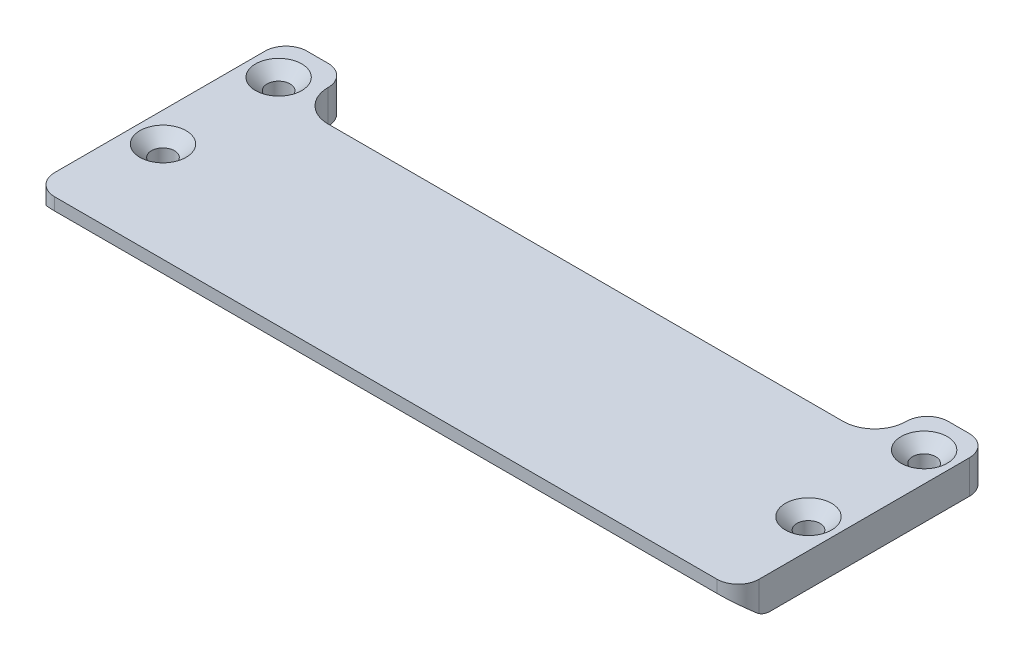
ISO-10303-21;
HEADER;
FILE_DESCRIPTION(('STEP AP214'),'2;1');
FILE_NAME('part.step','',(''),(''),'','','');
FILE_SCHEMA(('AUTOMOTIVE_DESIGN { 1 0 10303 214 1 1 1 1 }'));
ENDSEC;
DATA;
#1=APPLICATION_CONTEXT('core data for automotive mechanical design processes');
#2=APPLICATION_PROTOCOL_DEFINITION('international standard','automotive_design',2000,#1);
#3=PRODUCT_CONTEXT('',#1,'mechanical');
#4=PRODUCT('Part','Part','',(#3));
#5=PRODUCT_RELATED_PRODUCT_CATEGORY('part','',(#4));
#6=PRODUCT_DEFINITION_FORMATION('','',#4);
#7=PRODUCT_DEFINITION_CONTEXT('part definition',#1,'design');
#8=PRODUCT_DEFINITION('design','',#6,#7);
#9=PRODUCT_DEFINITION_SHAPE('','',#8);
#10=(LENGTH_UNIT() NAMED_UNIT(*) SI_UNIT(.MILLI.,.METRE.));
#11=(NAMED_UNIT(*) PLANE_ANGLE_UNIT() SI_UNIT($,.RADIAN.));
#12=(NAMED_UNIT(*) SI_UNIT($,.STERADIAN.) SOLID_ANGLE_UNIT());
#13=UNCERTAINTY_MEASURE_WITH_UNIT(LENGTH_MEASURE(1.E-05),#10,'distance_accuracy_value','');
#14=(GEOMETRIC_REPRESENTATION_CONTEXT(3) GLOBAL_UNCERTAINTY_ASSIGNED_CONTEXT((#13)) GLOBAL_UNIT_ASSIGNED_CONTEXT((#10,
#11,#12)) REPRESENTATION_CONTEXT('',''));
#15=CARTESIAN_POINT('',(0.,0.,0.));
#16=DIRECTION('',(0.,0.,1.));
#17=DIRECTION('',(1.,0.,0.));
#18=AXIS2_PLACEMENT_3D('',#15,#16,#17);
#19=CARTESIAN_POINT('',(-33.5,3.175,-12.));
#20=DIRECTION('',(0.,0.,1.));
#21=DIRECTION('',(1.,0.,0.));
#22=AXIS2_PLACEMENT_3D('',#19,#20,#21);
#23=PLANE('',#22);
#24=DIRECTION('',(-1.,0.,0.));
#25=VECTOR('',#24,1.);
#26=CARTESIAN_POINT('',(-33.5,3.175,-12.));
#27=LINE('',#26,#25);
#28=CARTESIAN_POINT('',(31.5,3.175,-12.));
#29=VERTEX_POINT('',#28);
#30=CARTESIAN_POINT('',(29.5,3.175,-12.));
#31=VERTEX_POINT('',#30);
#32=EDGE_CURVE('E297',#29,#31,#27,.T.);
#33=ORIENTED_EDGE('',*,*,#32,.F.);
#34=DIRECTION('',(0.,-1.,0.));
#35=VECTOR('',#34,1.);
#36=CARTESIAN_POINT('',(31.5,3.175,-12.));
#37=LINE('',#36,#35);
#38=CARTESIAN_POINT('',(31.5,0.,-12.));
#39=VERTEX_POINT('',#38);
#40=EDGE_CURVE('E209',#29,#39,#37,.T.);
#41=ORIENTED_EDGE('',*,*,#40,.T.);
#42=DIRECTION('',(-1.,0.,0.));
#43=VECTOR('',#42,1.);
#44=CARTESIAN_POINT('',(-33.5,0.,-12.));
#45=LINE('',#44,#43);
#46=CARTESIAN_POINT('',(29.5,0.,-12.));
#47=VERTEX_POINT('',#46);
#48=EDGE_CURVE('E363',#39,#47,#45,.T.);
#49=ORIENTED_EDGE('',*,*,#48,.T.);
#50=DIRECTION('',(0.,1.,0.));
#51=VECTOR('',#50,1.);
#52=CARTESIAN_POINT('',(29.5,3.175,-12.));
#53=LINE('',#52,#51);
#54=EDGE_CURVE('E206',#47,#31,#53,.T.);
#55=ORIENTED_EDGE('',*,*,#54,.T.);
#56=EDGE_LOOP('',(#33,#41,#49,#55));
#57=FACE_BOUND('',#56,.T.);
#58=ADVANCED_FACE('F35',(#57),#23,.F.);
#59=CARTESIAN_POINT('',(33.5,3.175,12.));
#60=DIRECTION('',(-1.,0.,0.));
#61=DIRECTION('',(0.,0.,1.));
#62=AXIS2_PLACEMENT_3D('',#59,#60,#61);
#63=PLANE('',#62);
#64=DIRECTION('',(0.,0.,-1.));
#65=VECTOR('',#64,1.);
#66=CARTESIAN_POINT('',(33.5,0.,12.));
#67=LINE('',#66,#65);
#68=CARTESIAN_POINT('',(33.5,0.,8.88855234627917));
#69=VERTEX_POINT('',#68);
#70=CARTESIAN_POINT('',(33.5,0.,-10.));
#71=VERTEX_POINT('',#70);
#72=EDGE_CURVE('E155',#69,#71,#67,.T.);
#73=ORIENTED_EDGE('',*,*,#72,.T.);
#74=DIRECTION('',(0.,-1.,0.));
#75=VECTOR('',#74,1.);
#76=CARTESIAN_POINT('',(33.5,3.175,-10.));
#77=LINE('',#76,#75);
#78=CARTESIAN_POINT('',(33.5,3.175,-10.));
#79=VERTEX_POINT('',#78);
#80=EDGE_CURVE('E220',#71,#79,#77,.F.);
#81=ORIENTED_EDGE('',*,*,#80,.T.);
#82=DIRECTION('',(0.,0.,-1.));
#83=VECTOR('',#82,1.);
#84=CARTESIAN_POINT('',(33.5,3.175,12.));
#85=LINE('',#84,#83);
#86=CARTESIAN_POINT('',(33.5,3.175,10.));
#87=VERTEX_POINT('',#86);
#88=EDGE_CURVE('E298',#87,#79,#85,.T.);
#89=ORIENTED_EDGE('',*,*,#88,.F.);
#90=DIRECTION('',(0.,-1.,0.));
#91=VECTOR('',#90,1.);
#92=CARTESIAN_POINT('',(33.5,3.175,10.));
#93=LINE('',#92,#91);
#94=CARTESIAN_POINT('',(33.5,0.337266072686776,10.));
#95=VERTEX_POINT('',#94);
#96=EDGE_CURVE('E159',#87,#95,#93,.T.);
#97=ORIENTED_EDGE('',*,*,#96,.T.);
#98=CARTESIAN_POINT('',(33.5,2.,8.88855234627917));
#99=DIRECTION('',(-1.,0.,0.));
#100=DIRECTION('',(0.,0.,1.));
#101=AXIS2_PLACEMENT_3D('',#98,#99,#100);
#102=CIRCLE('',#101,2.);
#103=EDGE_CURVE('E152',#95,#69,#102,.F.);
#104=ORIENTED_EDGE('',*,*,#103,.T.);
#105=EDGE_LOOP('',(#73,#81,#89,#97,#104));
#106=FACE_BOUND('',#105,.T.);
#107=ADVANCED_FACE('F154',(#106),#63,.F.);
#108=CARTESIAN_POINT('',(-29.5,3.175,-12.));
#109=VERTEX_POINT('',#108);
#110=CARTESIAN_POINT('',(-31.5,3.175,-12.));
#111=VERTEX_POINT('',#110);
#112=EDGE_CURVE('E290',#109,#111,#27,.T.);
#113=ORIENTED_EDGE('',*,*,#112,.F.);
#114=DIRECTION('',(0.,-1.,0.));
#115=VECTOR('',#114,1.);
#116=CARTESIAN_POINT('',(-29.5,3.175,-12.));
#117=LINE('',#116,#115);
#118=CARTESIAN_POINT('',(-29.5,0.,-12.));
#119=VERTEX_POINT('',#118);
#120=EDGE_CURVE('E11',#109,#119,#117,.T.);
#121=ORIENTED_EDGE('',*,*,#120,.T.);
#122=CARTESIAN_POINT('',(-31.5,0.,-12.));
#123=VERTEX_POINT('',#122);
#124=EDGE_CURVE('E173',#119,#123,#45,.T.);
#125=ORIENTED_EDGE('',*,*,#124,.T.);
#126=DIRECTION('',(0.,-1.,0.));
#127=VECTOR('',#126,1.);
#128=CARTESIAN_POINT('',(-31.5,3.175,-12.));
#129=LINE('',#128,#127);
#130=EDGE_CURVE('E43',#123,#111,#129,.F.);
#131=ORIENTED_EDGE('',*,*,#130,.T.);
#132=EDGE_LOOP('',(#113,#121,#125,#131));
#133=FACE_BOUND('',#132,.T.);
#134=ADVANCED_FACE('F273',(#133),#23,.F.);
#135=CARTESIAN_POINT('',(-33.5,3.175,12.));
#136=DIRECTION('',(1.,0.,0.));
#137=DIRECTION('',(0.,0.,-1.));
#138=AXIS2_PLACEMENT_3D('',#135,#136,#137);
#139=PLANE('',#138);
#140=CARTESIAN_POINT('',(-33.5,2.,8.88855234627917));
#141=DIRECTION('',(1.,0.,0.));
#142=DIRECTION('',(0.,0.,-1.));
#143=AXIS2_PLACEMENT_3D('',#140,#141,#142);
#144=CIRCLE('',#143,2.);
#145=CARTESIAN_POINT('',(-33.5,0.,8.88855234627917));
#146=VERTEX_POINT('',#145);
#147=CARTESIAN_POINT('',(-33.5,0.337266072686776,10.));
#148=VERTEX_POINT('',#147);
#149=EDGE_CURVE('E179',#146,#148,#144,.F.);
#150=ORIENTED_EDGE('',*,*,#149,.T.);
#151=DIRECTION('',(0.,-1.,0.));
#152=VECTOR('',#151,1.);
#153=CARTESIAN_POINT('',(-33.5,3.175,10.));
#154=LINE('',#153,#152);
#155=CARTESIAN_POINT('',(-33.5,3.175,10.));
#156=VERTEX_POINT('',#155);
#157=EDGE_CURVE('E398',#148,#156,#154,.F.);
#158=ORIENTED_EDGE('',*,*,#157,.T.);
#159=DIRECTION('',(0.,0.,1.));
#160=VECTOR('',#159,1.);
#161=CARTESIAN_POINT('',(-33.5,3.175,12.));
#162=LINE('',#161,#160);
#163=CARTESIAN_POINT('',(-33.5,3.175,-10.));
#164=VERTEX_POINT('',#163);
#165=EDGE_CURVE('E358',#164,#156,#162,.T.);
#166=ORIENTED_EDGE('',*,*,#165,.F.);
#167=DIRECTION('',(0.,-1.,0.));
#168=VECTOR('',#167,1.);
#169=CARTESIAN_POINT('',(-33.5,3.175,-10.));
#170=LINE('',#169,#168);
#171=CARTESIAN_POINT('',(-33.5,0.,-10.));
#172=VERTEX_POINT('',#171);
#173=EDGE_CURVE('E396',#164,#172,#170,.T.);
#174=ORIENTED_EDGE('',*,*,#173,.T.);
#175=DIRECTION('',(0.,0.,1.));
#176=VECTOR('',#175,1.);
#177=CARTESIAN_POINT('',(-33.5,0.,12.));
#178=LINE('',#177,#176);
#179=EDGE_CURVE('E356',#172,#146,#178,.T.);
#180=ORIENTED_EDGE('',*,*,#179,.T.);
#181=EDGE_LOOP('',(#150,#158,#166,#174,#180));
#182=FACE_BOUND('',#181,.T.);
#183=ADVANCED_FACE('F281',(#182),#139,.F.);
#184=CARTESIAN_POINT('',(-33.5,3.175,12.));
#185=DIRECTION('',(0.,0.,-1.));
#186=DIRECTION('',(-1.,0.,0.));
#187=AXIS2_PLACEMENT_3D('',#184,#185,#186);
#188=PLANE('',#187);
#189=DIRECTION('',(1.,0.,0.));
#190=VECTOR('',#189,1.);
#191=CARTESIAN_POINT('',(33.5,2.00000000000001,12.));
#192=LINE('',#191,#190);
#193=CARTESIAN_POINT('',(-31.5,2.00000000000001,12.));
#194=VERTEX_POINT('',#193);
#195=CARTESIAN_POINT('',(31.5,2.00000000000001,12.));
#196=VERTEX_POINT('',#195);
#197=EDGE_CURVE('E180',#194,#196,#192,.T.);
#198=ORIENTED_EDGE('',*,*,#197,.T.);
#199=DIRECTION('',(0.,-1.,0.));
#200=VECTOR('',#199,1.);
#201=CARTESIAN_POINT('',(31.5,3.175,12.));
#202=LINE('',#201,#200);
#203=CARTESIAN_POINT('',(31.5,3.175,12.));
#204=VERTEX_POINT('',#203);
#205=EDGE_CURVE('E394',#196,#204,#202,.F.);
#206=ORIENTED_EDGE('',*,*,#205,.T.);
#207=DIRECTION('',(1.,0.,0.));
#208=VECTOR('',#207,1.);
#209=CARTESIAN_POINT('',(-33.5,3.175,12.));
#210=LINE('',#209,#208);
#211=CARTESIAN_POINT('',(-31.5,3.175,12.));
#212=VERTEX_POINT('',#211);
#213=EDGE_CURVE('E183',#212,#204,#210,.T.);
#214=ORIENTED_EDGE('',*,*,#213,.F.);
#215=DIRECTION('',(0.,-1.,0.));
#216=VECTOR('',#215,1.);
#217=CARTESIAN_POINT('',(-31.5,3.175,12.));
#218=LINE('',#217,#216);
#219=EDGE_CURVE('E390',#212,#194,#218,.T.);
#220=ORIENTED_EDGE('',*,*,#219,.T.);
#221=EDGE_LOOP('',(#198,#206,#214,#220));
#222=FACE_BOUND('',#221,.T.);
#223=ADVANCED_FACE('F286',(#222),#188,.F.);
#224=CARTESIAN_POINT('',(0.,3.175,0.));
#225=DIRECTION('',(0.,-1.,0.));
#226=DIRECTION('',(0.,0.,-1.));
#227=AXIS2_PLACEMENT_3D('',#224,#225,#226);
#228=PLANE('',#227);
#229=CARTESIAN_POINT('',(-30.7,3.175,-8.5));
#230=DIRECTION('',(0.,1.,0.));
#231=DIRECTION('',(0.,0.,1.));
#232=AXIS2_PLACEMENT_3D('',#229,#230,#231);
#233=CIRCLE('',#232,2.2);
#234=CARTESIAN_POINT('',(-30.7,3.175,-6.3));
#235=VERTEX_POINT('',#234);
#236=EDGE_CURVE('E319',#235,#235,#233,.T.);
#237=ORIENTED_EDGE('',*,*,#236,.F.);
#238=EDGE_LOOP('',(#237));
#239=FACE_BOUND('',#238,.T.);
#240=CARTESIAN_POINT('',(-30.7,3.175,2.5));
#241=DIRECTION('',(0.,1.,0.));
#242=DIRECTION('',(0.,0.,1.));
#243=AXIS2_PLACEMENT_3D('',#240,#241,#242);
#244=CIRCLE('',#243,2.2);
#245=CARTESIAN_POINT('',(-30.7,3.175,4.7));
#246=VERTEX_POINT('',#245);
#247=EDGE_CURVE('E330',#246,#246,#244,.T.);
#248=ORIENTED_EDGE('',*,*,#247,.F.);
#249=EDGE_LOOP('',(#248));
#250=FACE_BOUND('',#249,.T.);
#251=CARTESIAN_POINT('',(30.7,3.175,2.5));
#252=DIRECTION('',(0.,1.,0.));
#253=DIRECTION('',(0.,0.,1.));
#254=AXIS2_PLACEMENT_3D('',#251,#252,#253);
#255=CIRCLE('',#254,2.2);
#256=CARTESIAN_POINT('',(30.7,3.175,4.7));
#257=VERTEX_POINT('',#256);
#258=EDGE_CURVE('E339',#257,#257,#255,.T.);
#259=ORIENTED_EDGE('',*,*,#258,.F.);
#260=EDGE_LOOP('',(#259));
#261=FACE_BOUND('',#260,.T.);
#262=CARTESIAN_POINT('',(30.7,3.175,-8.5));
#263=DIRECTION('',(0.,1.,0.));
#264=DIRECTION('',(0.,0.,1.));
#265=AXIS2_PLACEMENT_3D('',#262,#263,#264);
#266=CIRCLE('',#265,2.2);
#267=CARTESIAN_POINT('',(30.7,3.175,-6.3));
#268=VERTEX_POINT('',#267);
#269=EDGE_CURVE('E348',#268,#268,#266,.T.);
#270=ORIENTED_EDGE('',*,*,#269,.F.);
#271=EDGE_LOOP('',(#270));
#272=FACE_BOUND('',#271,.T.);
#273=ORIENTED_EDGE('',*,*,#88,.T.);
#274=CARTESIAN_POINT('',(31.5,3.175,-10.));
#275=DIRECTION('',(0.,-1.,0.));
#276=DIRECTION('',(0.,0.,-1.));
#277=AXIS2_PLACEMENT_3D('',#274,#275,#276);
#278=CIRCLE('',#277,2.);
#279=EDGE_CURVE('E232',#79,#29,#278,.F.);
#280=ORIENTED_EDGE('',*,*,#279,.T.);
#281=ORIENTED_EDGE('',*,*,#32,.T.);
#282=CARTESIAN_POINT('',(29.5,3.175,-10.));
#283=DIRECTION('',(0.,-1.,0.));
#284=DIRECTION('',(0.,0.,-1.));
#285=AXIS2_PLACEMENT_3D('',#282,#283,#284);
#286=CIRCLE('',#285,2.);
#287=CARTESIAN_POINT('',(27.5,3.175,-10.));
#288=VERTEX_POINT('',#287);
#289=EDGE_CURVE('E224',#31,#288,#286,.F.);
#290=ORIENTED_EDGE('',*,*,#289,.T.);
#291=CARTESIAN_POINT('',(24.5,3.175,-10.));
#292=DIRECTION('',(0.,-1.,0.));
#293=DIRECTION('',(0.,0.,-1.));
#294=AXIS2_PLACEMENT_3D('',#291,#292,#293);
#295=CIRCLE('',#294,3.);
#296=CARTESIAN_POINT('',(24.5,3.175,-7.));
#297=VERTEX_POINT('',#296);
#298=EDGE_CURVE('E198',#288,#297,#295,.T.);
#299=ORIENTED_EDGE('',*,*,#298,.T.);
#300=DIRECTION('',(1.,0.,0.));
#301=VECTOR('',#300,1.);
#302=CARTESIAN_POINT('',(-27.5,3.175,-7.));
#303=LINE('',#302,#301);
#304=CARTESIAN_POINT('',(-24.5,3.175,-7.));
#305=VERTEX_POINT('',#304);
#306=EDGE_CURVE('E312',#305,#297,#303,.T.);
#307=ORIENTED_EDGE('',*,*,#306,.F.);
#308=CARTESIAN_POINT('',(-24.5,3.175,-10.));
#309=DIRECTION('',(0.,-1.,0.));
#310=DIRECTION('',(0.,0.,-1.));
#311=AXIS2_PLACEMENT_3D('',#308,#309,#310);
#312=CIRCLE('',#311,3.);
#313=CARTESIAN_POINT('',(-27.5,3.175,-10.));
#314=VERTEX_POINT('',#313);
#315=EDGE_CURVE('E202',#305,#314,#312,.T.);
#316=ORIENTED_EDGE('',*,*,#315,.T.);
#317=CARTESIAN_POINT('',(-29.5,3.175,-10.));
#318=DIRECTION('',(0.,-1.,0.));
#319=DIRECTION('',(0.,0.,-1.));
#320=AXIS2_PLACEMENT_3D('',#317,#318,#319);
#321=CIRCLE('',#320,2.);
#322=EDGE_CURVE('E226',#314,#109,#321,.F.);
#323=ORIENTED_EDGE('',*,*,#322,.T.);
#324=ORIENTED_EDGE('',*,*,#112,.T.);
#325=CARTESIAN_POINT('',(-31.5,3.175,-10.));
#326=DIRECTION('',(0.,-1.,0.));
#327=DIRECTION('',(0.,0.,-1.));
#328=AXIS2_PLACEMENT_3D('',#325,#326,#327);
#329=CIRCLE('',#328,2.);
#330=EDGE_CURVE('E222',#111,#164,#329,.F.);
#331=ORIENTED_EDGE('',*,*,#330,.T.);
#332=ORIENTED_EDGE('',*,*,#165,.T.);
#333=CARTESIAN_POINT('',(-31.5,3.175,10.));
#334=DIRECTION('',(0.,-1.,0.));
#335=DIRECTION('',(0.,0.,-1.));
#336=AXIS2_PLACEMENT_3D('',#333,#334,#335);
#337=CIRCLE('',#336,2.);
#338=EDGE_CURVE('E228',#156,#212,#337,.F.);
#339=ORIENTED_EDGE('',*,*,#338,.T.);
#340=ORIENTED_EDGE('',*,*,#213,.T.);
#341=CARTESIAN_POINT('',(31.5,3.175,10.));
#342=DIRECTION('',(0.,-1.,0.));
#343=DIRECTION('',(0.,0.,-1.));
#344=AXIS2_PLACEMENT_3D('',#341,#342,#343);
#345=CIRCLE('',#344,2.);
#346=EDGE_CURVE('E230',#204,#87,#345,.F.);
#347=ORIENTED_EDGE('',*,*,#346,.T.);
#348=EDGE_LOOP('',(#273,#280,#281,#290,#299,#307,#316,#323,#324,#331,#332,#339,#340,#347));
#349=FACE_BOUND('',#348,.T.);
#350=ADVANCED_FACE('F316',(#239,#250,#261,#272,#349),#228,.F.);
#351=CARTESIAN_POINT('',(0.,0.,0.));
#352=DIRECTION('',(0.,-1.,0.));
#353=DIRECTION('',(0.,0.,-1.));
#354=AXIS2_PLACEMENT_3D('',#351,#352,#353);
#355=PLANE('',#354);
#356=ORIENTED_EDGE('',*,*,#48,.F.);
#357=CARTESIAN_POINT('',(31.5,0.,-10.));
#358=DIRECTION('',(0.,-1.,0.));
#359=DIRECTION('',(0.,0.,-1.));
#360=AXIS2_PLACEMENT_3D('',#357,#358,#359);
#361=CIRCLE('',#360,2.);
#362=EDGE_CURVE('E172',#39,#71,#361,.T.);
#363=ORIENTED_EDGE('',*,*,#362,.T.);
#364=ORIENTED_EDGE('',*,*,#72,.F.);
#365=DIRECTION('',(-1.,0.,0.));
#366=VECTOR('',#365,1.);
#367=CARTESIAN_POINT('',(0.,0.,8.88855234627917));
#368=LINE('',#367,#366);
#369=EDGE_CURVE('E171',#69,#146,#368,.T.);
#370=ORIENTED_EDGE('',*,*,#369,.T.);
#371=ORIENTED_EDGE('',*,*,#179,.F.);
#372=CARTESIAN_POINT('',(-31.5,0.,-10.));
#373=DIRECTION('',(0.,-1.,0.));
#374=DIRECTION('',(0.,0.,-1.));
#375=AXIS2_PLACEMENT_3D('',#372,#373,#374);
#376=CIRCLE('',#375,2.);
#377=EDGE_CURVE('E212',#172,#123,#376,.T.);
#378=ORIENTED_EDGE('',*,*,#377,.T.);
#379=ORIENTED_EDGE('',*,*,#124,.F.);
#380=CARTESIAN_POINT('',(-29.5,0.,-10.));
#381=DIRECTION('',(0.,-1.,0.));
#382=DIRECTION('',(0.,0.,-1.));
#383=AXIS2_PLACEMENT_3D('',#380,#381,#382);
#384=CIRCLE('',#383,2.);
#385=CARTESIAN_POINT('',(-27.5,0.,-10.));
#386=VERTEX_POINT('',#385);
#387=EDGE_CURVE('E216',#119,#386,#384,.T.);
#388=ORIENTED_EDGE('',*,*,#387,.T.);
#389=CARTESIAN_POINT('',(-24.5,0.,-10.));
#390=DIRECTION('',(0.,-1.,0.));
#391=DIRECTION('',(0.,0.,-1.));
#392=AXIS2_PLACEMENT_3D('',#389,#390,#391);
#393=CIRCLE('',#392,3.);
#394=CARTESIAN_POINT('',(-24.5,0.,-7.));
#395=VERTEX_POINT('',#394);
#396=EDGE_CURVE('E204',#386,#395,#393,.F.);
#397=ORIENTED_EDGE('',*,*,#396,.T.);
#398=DIRECTION('',(1.,0.,0.));
#399=VECTOR('',#398,1.);
#400=CARTESIAN_POINT('',(-27.5,0.,-7.));
#401=LINE('',#400,#399);
#402=CARTESIAN_POINT('',(24.5,0.,-7.));
#403=VERTEX_POINT('',#402);
#404=EDGE_CURVE('E314',#395,#403,#401,.T.);
#405=ORIENTED_EDGE('',*,*,#404,.T.);
#406=CARTESIAN_POINT('',(24.5,0.,-10.));
#407=DIRECTION('',(0.,-1.,0.));
#408=DIRECTION('',(0.,0.,-1.));
#409=AXIS2_PLACEMENT_3D('',#406,#407,#408);
#410=CIRCLE('',#409,3.);
#411=CARTESIAN_POINT('',(27.5,0.,-10.));
#412=VERTEX_POINT('',#411);
#413=EDGE_CURVE('E200',#403,#412,#410,.F.);
#414=ORIENTED_EDGE('',*,*,#413,.T.);
#415=CARTESIAN_POINT('',(29.5,0.,-10.));
#416=DIRECTION('',(0.,-1.,0.));
#417=DIRECTION('',(0.,0.,-1.));
#418=AXIS2_PLACEMENT_3D('',#415,#416,#417);
#419=CIRCLE('',#418,2.);
#420=EDGE_CURVE('E214',#412,#47,#419,.T.);
#421=ORIENTED_EDGE('',*,*,#420,.T.);
#422=EDGE_LOOP('',(#356,#363,#364,#370,#371,#378,#379,#388,#397,#405,#414,#421));
#423=FACE_BOUND('',#422,.T.);
#424=CARTESIAN_POINT('',(-30.7,0.,-8.5));
#425=DIRECTION('',(0.,1.,0.));
#426=DIRECTION('',(0.,0.,1.));
#427=AXIS2_PLACEMENT_3D('',#424,#425,#426);
#428=CIRCLE('',#427,1.1);
#429=CARTESIAN_POINT('',(-30.7,0.,-7.4));
#430=VERTEX_POINT('',#429);
#431=EDGE_CURVE('E327',#430,#430,#428,.T.);
#432=ORIENTED_EDGE('',*,*,#431,.T.);
#433=EDGE_LOOP('',(#432));
#434=FACE_BOUND('',#433,.T.);
#435=CARTESIAN_POINT('',(-30.7,0.,2.5));
#436=DIRECTION('',(0.,1.,0.));
#437=DIRECTION('',(0.,0.,1.));
#438=AXIS2_PLACEMENT_3D('',#435,#436,#437);
#439=CIRCLE('',#438,1.1);
#440=CARTESIAN_POINT('',(-30.7,0.,3.6));
#441=VERTEX_POINT('',#440);
#442=EDGE_CURVE('E336',#441,#441,#439,.T.);
#443=ORIENTED_EDGE('',*,*,#442,.T.);
#444=EDGE_LOOP('',(#443));
#445=FACE_BOUND('',#444,.T.);
#446=CARTESIAN_POINT('',(30.7,0.,2.5));
#447=DIRECTION('',(0.,1.,0.));
#448=DIRECTION('',(0.,0.,1.));
#449=AXIS2_PLACEMENT_3D('',#446,#447,#448);
#450=CIRCLE('',#449,1.1);
#451=CARTESIAN_POINT('',(30.7,0.,3.6));
#452=VERTEX_POINT('',#451);
#453=EDGE_CURVE('E345',#452,#452,#450,.T.);
#454=ORIENTED_EDGE('',*,*,#453,.T.);
#455=EDGE_LOOP('',(#454));
#456=FACE_BOUND('',#455,.T.);
#457=CARTESIAN_POINT('',(30.7,0.,-8.5));
#458=DIRECTION('',(0.,1.,0.));
#459=DIRECTION('',(0.,0.,1.));
#460=AXIS2_PLACEMENT_3D('',#457,#458,#459);
#461=CIRCLE('',#460,1.1);
#462=CARTESIAN_POINT('',(30.7,0.,-7.4));
#463=VERTEX_POINT('',#462);
#464=EDGE_CURVE('E174',#463,#463,#461,.T.);
#465=ORIENTED_EDGE('',*,*,#464,.T.);
#466=EDGE_LOOP('',(#465));
#467=FACE_BOUND('',#466,.T.);
#468=ADVANCED_FACE('F168',(#423,#434,#445,#456,#467),#355,.T.);
#469=CARTESIAN_POINT('',(30.7,3.175,-8.5));
#470=DIRECTION('',(0.,1.,0.));
#471=DIRECTION('',(0.,0.,1.));
#472=AXIS2_PLACEMENT_3D('',#469,#470,#471);
#473=CYLINDRICAL_SURFACE('',#472,1.1);
#474=ORIENTED_EDGE('',*,*,#464,.F.);
#475=EDGE_LOOP('',(#474));
#476=FACE_BOUND('',#475,.T.);
#477=CARTESIAN_POINT('',(30.7,2.075,-8.5));
#478=DIRECTION('',(0.,1.,0.));
#479=DIRECTION('',(0.,0.,1.));
#480=AXIS2_PLACEMENT_3D('',#477,#478,#479);
#481=CIRCLE('',#480,1.1);
#482=CARTESIAN_POINT('',(30.7,2.075,-7.4));
#483=VERTEX_POINT('',#482);
#484=EDGE_CURVE('E351',#483,#483,#481,.T.);
#485=ORIENTED_EDGE('',*,*,#484,.T.);
#486=EDGE_LOOP('',(#485));
#487=FACE_BOUND('',#486,.T.);
#488=ADVANCED_FACE('F446',(#476,#487),#473,.F.);
#489=CARTESIAN_POINT('',(30.7,3.175,-8.5));
#490=DIRECTION('',(0.,1.,0.));
#491=DIRECTION('',(0.,0.,1.));
#492=AXIS2_PLACEMENT_3D('',#489,#490,#491);
#493=CONICAL_SURFACE('',#492,2.2,0.785398163397447);
#494=ORIENTED_EDGE('',*,*,#484,.F.);
#495=EDGE_LOOP('',(#494));
#496=FACE_BOUND('',#495,.T.);
#497=ORIENTED_EDGE('',*,*,#269,.T.);
#498=EDGE_LOOP('',(#497));
#499=FACE_BOUND('',#498,.T.);
#500=ADVANCED_FACE('F442',(#496,#499),#493,.F.);
#501=CARTESIAN_POINT('',(30.7,3.175,2.5));
#502=DIRECTION('',(0.,1.,0.));
#503=DIRECTION('',(0.,0.,1.));
#504=AXIS2_PLACEMENT_3D('',#501,#502,#503);
#505=CYLINDRICAL_SURFACE('',#504,1.1);
#506=ORIENTED_EDGE('',*,*,#453,.F.);
#507=EDGE_LOOP('',(#506));
#508=FACE_BOUND('',#507,.T.);
#509=CARTESIAN_POINT('',(30.7,2.075,2.5));
#510=DIRECTION('',(0.,1.,0.));
#511=DIRECTION('',(0.,0.,1.));
#512=AXIS2_PLACEMENT_3D('',#509,#510,#511);
#513=CIRCLE('',#512,1.1);
#514=CARTESIAN_POINT('',(30.7,2.075,3.6));
#515=VERTEX_POINT('',#514);
#516=EDGE_CURVE('E342',#515,#515,#513,.T.);
#517=ORIENTED_EDGE('',*,*,#516,.T.);
#518=EDGE_LOOP('',(#517));
#519=FACE_BOUND('',#518,.T.);
#520=ADVANCED_FACE('F438',(#508,#519),#505,.F.);
#521=CARTESIAN_POINT('',(30.7,3.175,2.5));
#522=DIRECTION('',(0.,1.,0.));
#523=DIRECTION('',(0.,0.,1.));
#524=AXIS2_PLACEMENT_3D('',#521,#522,#523);
#525=CONICAL_SURFACE('',#524,2.2,0.785398163397447);
#526=ORIENTED_EDGE('',*,*,#516,.F.);
#527=EDGE_LOOP('',(#526));
#528=FACE_BOUND('',#527,.T.);
#529=ORIENTED_EDGE('',*,*,#258,.T.);
#530=EDGE_LOOP('',(#529));
#531=FACE_BOUND('',#530,.T.);
#532=ADVANCED_FACE('F434',(#528,#531),#525,.F.);
#533=CARTESIAN_POINT('',(-30.7,3.175,2.5));
#534=DIRECTION('',(0.,1.,0.));
#535=DIRECTION('',(0.,0.,1.));
#536=AXIS2_PLACEMENT_3D('',#533,#534,#535);
#537=CYLINDRICAL_SURFACE('',#536,1.1);
#538=ORIENTED_EDGE('',*,*,#442,.F.);
#539=EDGE_LOOP('',(#538));
#540=FACE_BOUND('',#539,.T.);
#541=CARTESIAN_POINT('',(-30.7,2.075,2.5));
#542=DIRECTION('',(0.,1.,0.));
#543=DIRECTION('',(0.,0.,1.));
#544=AXIS2_PLACEMENT_3D('',#541,#542,#543);
#545=CIRCLE('',#544,1.1);
#546=CARTESIAN_POINT('',(-30.7,2.075,3.6));
#547=VERTEX_POINT('',#546);
#548=EDGE_CURVE('E333',#547,#547,#545,.T.);
#549=ORIENTED_EDGE('',*,*,#548,.T.);
#550=EDGE_LOOP('',(#549));
#551=FACE_BOUND('',#550,.T.);
#552=ADVANCED_FACE('F430',(#540,#551),#537,.F.);
#553=CARTESIAN_POINT('',(-30.7,3.175,2.5));
#554=DIRECTION('',(0.,1.,0.));
#555=DIRECTION('',(0.,0.,1.));
#556=AXIS2_PLACEMENT_3D('',#553,#554,#555);
#557=CONICAL_SURFACE('',#556,2.2,0.785398163397448);
#558=ORIENTED_EDGE('',*,*,#548,.F.);
#559=EDGE_LOOP('',(#558));
#560=FACE_BOUND('',#559,.T.);
#561=ORIENTED_EDGE('',*,*,#247,.T.);
#562=EDGE_LOOP('',(#561));
#563=FACE_BOUND('',#562,.T.);
#564=ADVANCED_FACE('F422',(#560,#563),#557,.F.);
#565=CARTESIAN_POINT('',(-30.7,3.175,-8.5));
#566=DIRECTION('',(0.,1.,0.));
#567=DIRECTION('',(0.,0.,1.));
#568=AXIS2_PLACEMENT_3D('',#565,#566,#567);
#569=CYLINDRICAL_SURFACE('',#568,1.1);
#570=ORIENTED_EDGE('',*,*,#431,.F.);
#571=EDGE_LOOP('',(#570));
#572=FACE_BOUND('',#571,.T.);
#573=CARTESIAN_POINT('',(-30.7,2.075,-8.5));
#574=DIRECTION('',(0.,1.,0.));
#575=DIRECTION('',(0.,0.,1.));
#576=AXIS2_PLACEMENT_3D('',#573,#574,#575);
#577=CIRCLE('',#576,1.1);
#578=CARTESIAN_POINT('',(-30.7,2.075,-7.4));
#579=VERTEX_POINT('',#578);
#580=EDGE_CURVE('E324',#579,#579,#577,.T.);
#581=ORIENTED_EDGE('',*,*,#580,.T.);
#582=EDGE_LOOP('',(#581));
#583=FACE_BOUND('',#582,.T.);
#584=ADVANCED_FACE('F413',(#572,#583),#569,.F.);
#585=CARTESIAN_POINT('',(-30.7,3.175,-8.5));
#586=DIRECTION('',(0.,1.,0.));
#587=DIRECTION('',(0.,0.,1.));
#588=AXIS2_PLACEMENT_3D('',#585,#586,#587);
#589=CONICAL_SURFACE('',#588,2.2,0.785398163397448);
#590=ORIENTED_EDGE('',*,*,#580,.F.);
#591=EDGE_LOOP('',(#590));
#592=FACE_BOUND('',#591,.T.);
#593=ORIENTED_EDGE('',*,*,#236,.T.);
#594=EDGE_LOOP('',(#593));
#595=FACE_BOUND('',#594,.T.);
#596=ADVANCED_FACE('F407',(#592,#595),#589,.F.);
#597=CARTESIAN_POINT('',(-33.5,2.00000000000001,12.));
#598=DIRECTION('',(0.,-0.766044443118977,0.64278760968654));
#599=DIRECTION('',(-1.,0.,0.));
#600=AXIS2_PLACEMENT_3D('',#597,#598,#599);
#601=PLANE('',#600);
#602=DIRECTION('',(-1.,0.,0.));
#603=VECTOR('',#602,1.);
#604=CARTESIAN_POINT('',(-33.5,0.467911113762045,10.1741275656522));
#605=LINE('',#604,#603);
#606=CARTESIAN_POINT('',(-33.4924054785309,0.467911113762045,10.1741275656522));
#607=VERTEX_POINT('',#606);
#608=CARTESIAN_POINT('',(33.4924054785309,0.467911113762045,10.1741275656522));
#609=VERTEX_POINT('',#608);
#610=EDGE_CURVE('E163',#607,#609,#605,.F.);
#611=ORIENTED_EDGE('',*,*,#610,.T.);
#612=CARTESIAN_POINT('',(31.5,0.321800737645447,10.));
#613=DIRECTION('',(0.,-0.766044443118977,0.64278760968654));
#614=DIRECTION('',(0.,-0.64278760968654,-0.766044443118978));
#615=AXIS2_PLACEMENT_3D('',#612,#613,#614);
#616=ELLIPSE('',#615,2.61081457866456,2.);
#617=EDGE_CURVE('E50',#609,#196,#616,.T.);
#618=ORIENTED_EDGE('',*,*,#617,.T.);
#619=ORIENTED_EDGE('',*,*,#197,.F.);
#620=CARTESIAN_POINT('',(-31.5,0.321800737645447,10.));
#621=DIRECTION('',(0.,-0.766044443118977,0.64278760968654));
#622=DIRECTION('',(0.,-0.64278760968654,-0.766044443118978));
#623=AXIS2_PLACEMENT_3D('',#620,#621,#622);
#624=ELLIPSE('',#623,2.61081457866456,2.);
#625=EDGE_CURVE('E58',#194,#607,#624,.T.);
#626=ORIENTED_EDGE('',*,*,#625,.T.);
#627=EDGE_LOOP('',(#611,#618,#619,#626));
#628=FACE_BOUND('',#627,.T.);
#629=ADVANCED_FACE('F405',(#628),#601,.T.);
#630=CARTESIAN_POINT('',(-27.5,0.,-7.));
#631=DIRECTION('',(0.,0.,1.));
#632=DIRECTION('',(1.,0.,0.));
#633=AXIS2_PLACEMENT_3D('',#630,#631,#632);
#634=PLANE('',#633);
#635=ORIENTED_EDGE('',*,*,#306,.T.);
#636=DIRECTION('',(0.,1.,0.));
#637=VECTOR('',#636,1.);
#638=CARTESIAN_POINT('',(24.5,0.,-7.));
#639=LINE('',#638,#637);
#640=EDGE_CURVE('E193',#297,#403,#639,.F.);
#641=ORIENTED_EDGE('',*,*,#640,.T.);
#642=ORIENTED_EDGE('',*,*,#404,.F.);
#643=DIRECTION('',(0.,1.,0.));
#644=VECTOR('',#643,1.);
#645=CARTESIAN_POINT('',(-24.5,3.175,-7.));
#646=LINE('',#645,#644);
#647=EDGE_CURVE('E190',#395,#305,#646,.T.);
#648=ORIENTED_EDGE('',*,*,#647,.T.);
#649=EDGE_LOOP('',(#635,#641,#642,#648));
#650=FACE_BOUND('',#649,.T.);
#651=ADVANCED_FACE('F311',(#650),#634,.F.);
#652=CARTESIAN_POINT('',(0.,2.,8.88855234627917));
#653=DIRECTION('',(-1.,0.,0.));
#654=DIRECTION('',(0.,0.,1.));
#655=AXIS2_PLACEMENT_3D('',#652,#653,#654);
#656=CYLINDRICAL_SURFACE('',#655,2.);
#657=ORIENTED_EDGE('',*,*,#103,.F.);
#658=CARTESIAN_POINT('',(33.5,0.337266072686776,10.));
#659=CARTESIAN_POINT('',(33.5000000874026,0.347365513037475,10.0151091238285));
#660=CARTESIAN_POINT('',(33.4998287887284,0.357670946748156,10.0300800982773));
#661=CARTESIAN_POINT('',(33.4991631700587,0.378671731476619,10.0597158591714));
#662=CARTESIAN_POINT('',(33.4986691793482,0.389366674533469,10.074380942033));
#663=CARTESIAN_POINT('',(33.4973778542978,0.411144932368391,10.1034057416333));
#664=CARTESIAN_POINT('',(33.4965805228081,0.422228243496561,10.1177654612398));
#665=CARTESIAN_POINT('',(33.4947014820958,0.444783420313093,10.1461814229113));
#666=CARTESIAN_POINT('',(33.4936194836721,0.456255670751387,10.16023734053));
#667=CARTESIAN_POINT('',(33.4924054785309,0.467911113762045,10.1741275656522));
#668=B_SPLINE_CURVE_WITH_KNOTS('',3,(#658,#659,#660,#661,#662,#663,#664,#665,#666,#667),
.UNSPECIFIED.,.F.,.F.,(4,2,2,2,4),(0.,0.0545181369142833,0.108980728545657,0.163442808472221,
0.217960433076323),.UNSPECIFIED.);
#669=EDGE_CURVE('E242',#95,#609,#668,.T.);
#670=ORIENTED_EDGE('',*,*,#669,.T.);
#671=ORIENTED_EDGE('',*,*,#610,.F.);
#672=CARTESIAN_POINT('',(-33.4924054785309,0.467911113762045,10.1741275656522));
#673=CARTESIAN_POINT('',(-33.4936194836721,0.456255670751387,10.16023734053));
#674=CARTESIAN_POINT('',(-33.4947014820958,0.444783420313093,10.1461814229113));
#675=CARTESIAN_POINT('',(-33.4965805228081,0.42222824349656,10.1177654612398));
#676=CARTESIAN_POINT('',(-33.4973778542978,0.41114493236839,10.1034057416333));
#677=CARTESIAN_POINT('',(-33.4986691793482,0.389366674533469,10.074380942033));
#678=CARTESIAN_POINT('',(-33.4991631700587,0.378671731476618,10.0597158591714));
#679=CARTESIAN_POINT('',(-33.4998287887284,0.357670946748156,10.0300800982773));
#680=CARTESIAN_POINT('',(-33.5000000874026,0.347365513037475,10.0151091238285));
#681=CARTESIAN_POINT('',(-33.5,0.337266072686776,10.));
#682=B_SPLINE_CURVE_WITH_KNOTS('',3,(#672,#673,#674,#675,#676,#677,#678,#679,#680,#681),
.UNSPECIFIED.,.F.,.F.,(4,2,2,2,4),(0.,0.0545176246041026,0.108979704530665,0.16344229616204,
0.217960433076321),.UNSPECIFIED.);
#683=EDGE_CURVE('E234',#607,#148,#682,.T.);
#684=ORIENTED_EDGE('',*,*,#683,.T.);
#685=ORIENTED_EDGE('',*,*,#149,.F.);
#686=ORIENTED_EDGE('',*,*,#369,.F.);
#687=EDGE_LOOP('',(#657,#670,#671,#684,#685,#686));
#688=FACE_BOUND('',#687,.T.);
#689=ADVANCED_FACE('F177',(#688),#656,.T.);
#690=CARTESIAN_POINT('',(24.5,0.,-10.));
#691=DIRECTION('',(0.,-1.,0.));
#692=DIRECTION('',(0.,0.,-1.));
#693=AXIS2_PLACEMENT_3D('',#690,#691,#692);
#694=CYLINDRICAL_SURFACE('',#693,3.);
#695=ORIENTED_EDGE('',*,*,#413,.F.);
#696=ORIENTED_EDGE('',*,*,#640,.F.);
#697=ORIENTED_EDGE('',*,*,#298,.F.);
#698=DIRECTION('',(0.,1.,0.));
#699=VECTOR('',#698,1.);
#700=CARTESIAN_POINT('',(27.5,3.175,-10.));
#701=LINE('',#700,#699);
#702=EDGE_CURVE('E162',#412,#288,#701,.T.);
#703=ORIENTED_EDGE('',*,*,#702,.F.);
#704=EDGE_LOOP('',(#695,#696,#697,#703));
#705=FACE_BOUND('',#704,.T.);
#706=ADVANCED_FACE('F372',(#705),#694,.F.);
#707=CARTESIAN_POINT('',(-24.5,0.,-10.));
#708=DIRECTION('',(0.,-1.,0.));
#709=DIRECTION('',(0.,0.,-1.));
#710=AXIS2_PLACEMENT_3D('',#707,#708,#709);
#711=CYLINDRICAL_SURFACE('',#710,3.);
#712=ORIENTED_EDGE('',*,*,#396,.F.);
#713=DIRECTION('',(0.,1.,0.));
#714=VECTOR('',#713,1.);
#715=CARTESIAN_POINT('',(-27.5,0.,-10.));
#716=LINE('',#715,#714);
#717=EDGE_CURVE('E195',#314,#386,#716,.F.);
#718=ORIENTED_EDGE('',*,*,#717,.F.);
#719=ORIENTED_EDGE('',*,*,#315,.F.);
#720=ORIENTED_EDGE('',*,*,#647,.F.);
#721=EDGE_LOOP('',(#712,#718,#719,#720));
#722=FACE_BOUND('',#721,.T.);
#723=ADVANCED_FACE('F307',(#722),#711,.F.);
#724=CARTESIAN_POINT('',(31.5,3.175,-10.));
#725=DIRECTION('',(0.,-1.,0.));
#726=DIRECTION('',(0.,0.,-1.));
#727=AXIS2_PLACEMENT_3D('',#724,#725,#726);
#728=CYLINDRICAL_SURFACE('',#727,2.);
#729=ORIENTED_EDGE('',*,*,#279,.F.);
#730=ORIENTED_EDGE('',*,*,#80,.F.);
#731=ORIENTED_EDGE('',*,*,#362,.F.);
#732=ORIENTED_EDGE('',*,*,#40,.F.);
#733=EDGE_LOOP('',(#729,#730,#731,#732));
#734=FACE_BOUND('',#733,.T.);
#735=ADVANCED_FACE('F378',(#734),#728,.T.);
#736=CARTESIAN_POINT('',(31.5,3.175,10.));
#737=DIRECTION('',(0.,-1.,0.));
#738=DIRECTION('',(0.,0.,-1.));
#739=AXIS2_PLACEMENT_3D('',#736,#737,#738);
#740=CYLINDRICAL_SURFACE('',#739,2.);
#741=ORIENTED_EDGE('',*,*,#346,.F.);
#742=ORIENTED_EDGE('',*,*,#205,.F.);
#743=ORIENTED_EDGE('',*,*,#617,.F.);
#744=ORIENTED_EDGE('',*,*,#669,.F.);
#745=ORIENTED_EDGE('',*,*,#96,.F.);
#746=EDGE_LOOP('',(#741,#742,#743,#744,#745));
#747=FACE_BOUND('',#746,.T.);
#748=ADVANCED_FACE('F257',(#747),#740,.T.);
#749=CARTESIAN_POINT('',(-31.5,3.175,10.));
#750=DIRECTION('',(0.,-1.,0.));
#751=DIRECTION('',(0.,0.,-1.));
#752=AXIS2_PLACEMENT_3D('',#749,#750,#751);
#753=CYLINDRICAL_SURFACE('',#752,2.);
#754=ORIENTED_EDGE('',*,*,#338,.F.);
#755=ORIENTED_EDGE('',*,*,#157,.F.);
#756=ORIENTED_EDGE('',*,*,#683,.F.);
#757=ORIENTED_EDGE('',*,*,#625,.F.);
#758=ORIENTED_EDGE('',*,*,#219,.F.);
#759=EDGE_LOOP('',(#754,#755,#756,#757,#758));
#760=FACE_BOUND('',#759,.T.);
#761=ADVANCED_FACE('F252',(#760),#753,.T.);
#762=CARTESIAN_POINT('',(-29.5,3.175,-10.));
#763=DIRECTION('',(0.,-1.,0.));
#764=DIRECTION('',(0.,0.,-1.));
#765=AXIS2_PLACEMENT_3D('',#762,#763,#764);
#766=CYLINDRICAL_SURFACE('',#765,2.);
#767=ORIENTED_EDGE('',*,*,#322,.F.);
#768=ORIENTED_EDGE('',*,*,#717,.T.);
#769=ORIENTED_EDGE('',*,*,#387,.F.);
#770=ORIENTED_EDGE('',*,*,#120,.F.);
#771=EDGE_LOOP('',(#767,#768,#769,#770));
#772=FACE_BOUND('',#771,.T.);
#773=ADVANCED_FACE('F256',(#772),#766,.T.);
#774=CARTESIAN_POINT('',(29.5,3.175,-10.));
#775=DIRECTION('',(0.,1.,0.));
#776=DIRECTION('',(0.,0.,1.));
#777=AXIS2_PLACEMENT_3D('',#774,#775,#776);
#778=CYLINDRICAL_SURFACE('',#777,2.);
#779=ORIENTED_EDGE('',*,*,#420,.F.);
#780=ORIENTED_EDGE('',*,*,#702,.T.);
#781=ORIENTED_EDGE('',*,*,#289,.F.);
#782=ORIENTED_EDGE('',*,*,#54,.F.);
#783=EDGE_LOOP('',(#779,#780,#781,#782));
#784=FACE_BOUND('',#783,.T.);
#785=ADVANCED_FACE('F261',(#784),#778,.T.);
#786=CARTESIAN_POINT('',(-31.5,3.175,-10.));
#787=DIRECTION('',(0.,-1.,0.));
#788=DIRECTION('',(0.,0.,-1.));
#789=AXIS2_PLACEMENT_3D('',#786,#787,#788);
#790=CYLINDRICAL_SURFACE('',#789,2.);
#791=ORIENTED_EDGE('',*,*,#330,.F.);
#792=ORIENTED_EDGE('',*,*,#130,.F.);
#793=ORIENTED_EDGE('',*,*,#377,.F.);
#794=ORIENTED_EDGE('',*,*,#173,.F.);
#795=EDGE_LOOP('',(#791,#792,#793,#794));
#796=FACE_BOUND('',#795,.T.);
#797=ADVANCED_FACE('F37',(#796),#790,.T.);
#798=CLOSED_SHELL('',(#58,#107,#134,#183,#223,#350,#468,#488,#500,#520,#532,#552,#564,#584,#596,
#629,#651,#689,#706,#723,#735,#748,#761,#773,#785,#797));
#799=MANIFOLD_SOLID_BREP('B2',#798);
#800=ADVANCED_BREP_SHAPE_REPRESENTATION('',(#18,#799),#14);
#801=SHAPE_DEFINITION_REPRESENTATION(#9,#800);
ENDSEC;
END-ISO-10303-21;
